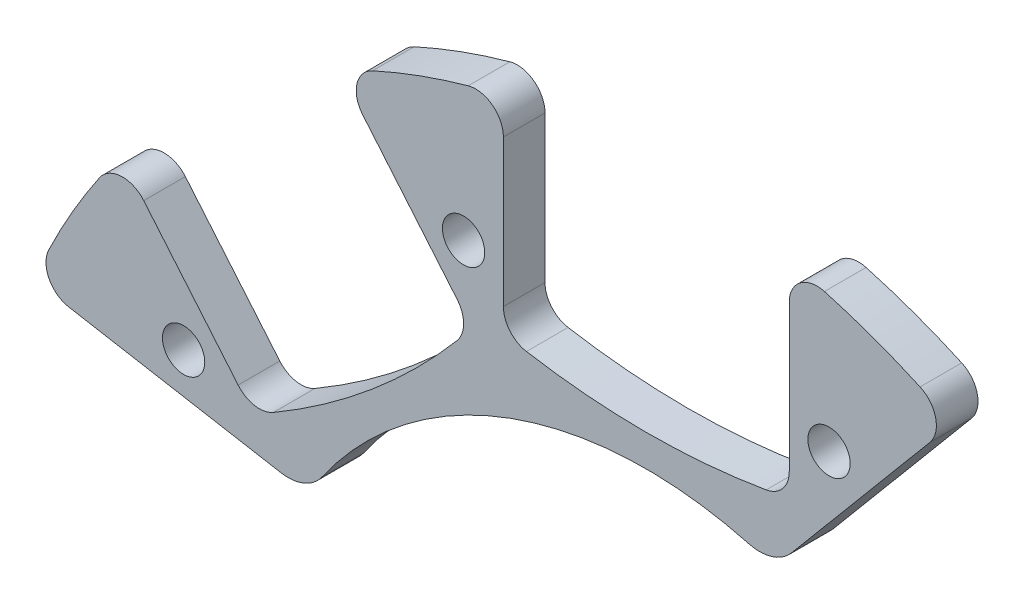
ISO-10303-21;
HEADER;
FILE_DESCRIPTION(('STEP AP214'),'2;1');
FILE_NAME('part.step','',(''),(''),'','','');
FILE_SCHEMA(('AUTOMOTIVE_DESIGN { 1 0 10303 214 1 1 1 1 }'));
ENDSEC;
DATA;
#1=APPLICATION_CONTEXT('core data for automotive mechanical design processes');
#2=APPLICATION_PROTOCOL_DEFINITION('international standard','automotive_design',2000,#1);
#3=PRODUCT_CONTEXT('',#1,'mechanical');
#4=PRODUCT('Part','Part','',(#3));
#5=PRODUCT_RELATED_PRODUCT_CATEGORY('part','',(#4));
#6=PRODUCT_DEFINITION_FORMATION('','',#4);
#7=PRODUCT_DEFINITION_CONTEXT('part definition',#1,'design');
#8=PRODUCT_DEFINITION('design','',#6,#7);
#9=PRODUCT_DEFINITION_SHAPE('','',#8);
#10=(LENGTH_UNIT() NAMED_UNIT(*) SI_UNIT(.MILLI.,.METRE.));
#11=(NAMED_UNIT(*) PLANE_ANGLE_UNIT() SI_UNIT($,.RADIAN.));
#12=(NAMED_UNIT(*) SI_UNIT($,.STERADIAN.) SOLID_ANGLE_UNIT());
#13=UNCERTAINTY_MEASURE_WITH_UNIT(LENGTH_MEASURE(1.E-05),#10,'distance_accuracy_value','');
#14=(GEOMETRIC_REPRESENTATION_CONTEXT(3) GLOBAL_UNCERTAINTY_ASSIGNED_CONTEXT((#13)) GLOBAL_UNIT_ASSIGNED_CONTEXT((#10,
#11,#12)) REPRESENTATION_CONTEXT('',''));
#15=CARTESIAN_POINT('',(0.,0.,0.));
#16=DIRECTION('',(0.,0.,1.));
#17=DIRECTION('',(1.,0.,0.));
#18=AXIS2_PLACEMENT_3D('',#15,#16,#17);
#19=CARTESIAN_POINT('',(0.,0.,3.));
#20=DIRECTION('',(0.,0.,-1.));
#21=DIRECTION('',(-1.,0.,0.));
#22=AXIS2_PLACEMENT_3D('',#19,#20,#21);
#23=CYLINDRICAL_SURFACE('',#22,47.75);
#24=CARTESIAN_POINT('',(0.,0.,0.));
#25=DIRECTION('',(0.,0.,1.));
#26=DIRECTION('',(1.,0.,0.));
#27=AXIS2_PLACEMENT_3D('',#24,#25,#26);
#28=CIRCLE('',#27,47.75);
#29=CARTESIAN_POINT('',(-39.3972827370427,26.9799298171347,0.));
#30=VERTEX_POINT('',#29);
#31=CARTESIAN_POINT('',(-43.0639459824808,20.6290827817907,0.));
#32=VERTEX_POINT('',#31);
#33=EDGE_CURVE('E332',#30,#32,#28,.T.);
#34=ORIENTED_EDGE('',*,*,#33,.T.);
#35=DIRECTION('',(0.,0.,-1.));
#36=VECTOR('',#35,1.);
#37=CARTESIAN_POINT('',(-43.0639459824808,20.6290827817908,3.));
#38=LINE('',#37,#36);
#39=CARTESIAN_POINT('',(-43.0639459824808,20.6290827817907,3.));
#40=VERTEX_POINT('',#39);
#41=EDGE_CURVE('E221',#32,#40,#38,.F.);
#42=ORIENTED_EDGE('',*,*,#41,.T.);
#43=CARTESIAN_POINT('',(0.,0.,3.));
#44=DIRECTION('',(0.,0.,1.));
#45=DIRECTION('',(1.,0.,0.));
#46=AXIS2_PLACEMENT_3D('',#43,#44,#45);
#47=CIRCLE('',#46,47.75);
#48=CARTESIAN_POINT('',(-39.3972827370427,26.9799298171347,3.));
#49=VERTEX_POINT('',#48);
#50=EDGE_CURVE('E211',#49,#40,#47,.T.);
#51=ORIENTED_EDGE('',*,*,#50,.F.);
#52=DIRECTION('',(0.,0.,-1.));
#53=VECTOR('',#52,1.);
#54=CARTESIAN_POINT('',(-39.3972827370427,26.9799298171347,3.));
#55=LINE('',#54,#53);
#56=EDGE_CURVE('E226',#49,#30,#55,.T.);
#57=ORIENTED_EDGE('',*,*,#56,.T.);
#58=EDGE_LOOP('',(#34,#42,#51,#57));
#59=FACE_BOUND('',#58,.T.);
#60=ADVANCED_FACE('F37',(#59),#23,.T.);
#61=CARTESIAN_POINT('',(-12.8377049180328,45.9919105108444,0.));
#62=VERTEX_POINT('',#61);
#63=CARTESIAN_POINT('',(-19.7287777073222,43.4837651333813,0.));
#64=VERTEX_POINT('',#63);
#65=EDGE_CURVE('E347',#62,#64,#28,.T.);
#66=ORIENTED_EDGE('',*,*,#65,.T.);
#67=DIRECTION('',(0.,0.,-1.));
#68=VECTOR('',#67,1.);
#69=CARTESIAN_POINT('',(-19.7287777073222,43.4837651333813,3.));
#70=LINE('',#69,#68);
#71=CARTESIAN_POINT('',(-19.7287777073222,43.4837651333813,3.));
#72=VERTEX_POINT('',#71);
#73=EDGE_CURVE('E231',#64,#72,#70,.F.);
#74=ORIENTED_EDGE('',*,*,#73,.T.);
#75=CARTESIAN_POINT('',(-12.8377049180328,45.9919105108444,3.));
#76=VERTEX_POINT('',#75);
#77=EDGE_CURVE('E342',#76,#72,#47,.T.);
#78=ORIENTED_EDGE('',*,*,#77,.F.);
#79=DIRECTION('',(0.,0.,-1.));
#80=VECTOR('',#79,1.);
#81=CARTESIAN_POINT('',(-12.8377049180328,45.9919105108444,3.));
#82=LINE('',#81,#80);
#83=EDGE_CURVE('E224',#76,#62,#82,.T.);
#84=ORIENTED_EDGE('',*,*,#83,.T.);
#85=EDGE_LOOP('',(#66,#74,#78,#84));
#86=FACE_BOUND('',#85,.T.);
#87=ADVANCED_FACE('F425',(#86),#23,.T.);
#88=CARTESIAN_POINT('',(19.7287777073227,43.483765133381,3.));
#89=VERTEX_POINT('',#88);
#90=CARTESIAN_POINT('',(12.8377049180328,45.9919105108444,3.));
#91=VERTEX_POINT('',#90);
#92=EDGE_CURVE('E344',#89,#91,#47,.T.);
#93=ORIENTED_EDGE('',*,*,#92,.F.);
#94=DIRECTION('',(0.,0.,-1.));
#95=VECTOR('',#94,1.);
#96=CARTESIAN_POINT('',(19.7287777073227,43.483765133381,3.));
#97=LINE('',#96,#95);
#98=CARTESIAN_POINT('',(19.7287777073227,43.483765133381,0.));
#99=VERTEX_POINT('',#98);
#100=EDGE_CURVE('E245',#89,#99,#97,.T.);
#101=ORIENTED_EDGE('',*,*,#100,.T.);
#102=CARTESIAN_POINT('',(12.8377049180328,45.9919105108444,0.));
#103=VERTEX_POINT('',#102);
#104=EDGE_CURVE('E343',#99,#103,#28,.T.);
#105=ORIENTED_EDGE('',*,*,#104,.T.);
#106=DIRECTION('',(0.,0.,-1.));
#107=VECTOR('',#106,1.);
#108=CARTESIAN_POINT('',(12.8377049180328,45.9919105108444,3.));
#109=LINE('',#108,#107);
#110=EDGE_CURVE('E242',#103,#91,#109,.F.);
#111=ORIENTED_EDGE('',*,*,#110,.T.);
#112=EDGE_LOOP('',(#93,#101,#105,#111));
#113=FACE_BOUND('',#112,.T.);
#114=ADVANCED_FACE('F427',(#113),#23,.T.);
#115=CARTESIAN_POINT('',(0.,0.,3.));
#116=DIRECTION('',(0.,0.,1.));
#117=DIRECTION('',(1.,0.,0.));
#118=AXIS2_PLACEMENT_3D('',#115,#116,#117);
#119=PLANE('',#118);
#120=DIRECTION('',(-0.984807753012206,0.17364817766694,0.));
#121=VECTOR('',#120,1.);
#122=CARTESIAN_POINT('',(-44.1289499231318,18.2400186042045,3.));
#123=LINE('',#122,#121);
#124=CARTESIAN_POINT('',(-26.332125888612,15.1019583559976,3.));
#125=VERTEX_POINT('',#124);
#126=CARTESIAN_POINT('',(-41.6075168516375,17.7954219236494,3.));
#127=VERTEX_POINT('',#126);
#128=EDGE_CURVE('E196',#125,#127,#123,.T.);
#129=ORIENTED_EDGE('',*,*,#128,.F.);
#130=CARTESIAN_POINT('',(-25.8111813556112,18.0563816150343,3.));
#131=DIRECTION('',(0.,0.,1.));
#132=DIRECTION('',(1.,0.,0.));
#133=AXIS2_PLACEMENT_3D('',#130,#131,#132);
#134=CIRCLE('',#133,3.);
#135=CARTESIAN_POINT('',(-23.3529736074578,16.3367262231262,3.));
#136=VERTEX_POINT('',#135);
#137=EDGE_CURVE('E45',#125,#136,#134,.T.);
#138=ORIENTED_EDGE('',*,*,#137,.T.);
#139=CARTESIAN_POINT('',(0.,0.,3.));
#140=DIRECTION('',(0.,0.,-1.));
#141=DIRECTION('',(-1.,0.,0.));
#142=AXIS2_PLACEMENT_3D('',#139,#140,#141);
#143=CIRCLE('',#142,28.5);
#144=CARTESIAN_POINT('',(7.38837046323079,27.5256604261925,3.));
#145=VERTEX_POINT('',#144);
#146=EDGE_CURVE('E299',#136,#145,#143,.T.);
#147=ORIENTED_EDGE('',*,*,#146,.T.);
#148=CARTESIAN_POINT('',(8.16609366988667,30.4230983657917,3.));
#149=DIRECTION('',(0.,0.,1.));
#150=DIRECTION('',(1.,0.,0.));
#151=AXIS2_PLACEMENT_3D('',#148,#149,#150);
#152=CIRCLE('',#151,3.);
#153=CARTESIAN_POINT('',(10.4642269992436,28.4947355367321,3.));
#154=VERTEX_POINT('',#153);
#155=EDGE_CURVE('E52',#145,#154,#152,.T.);
#156=ORIENTED_EDGE('',*,*,#155,.T.);
#157=DIRECTION('',(-0.642787609686541,-0.766044443118977,0.));
#158=VECTOR('',#157,1.);
#159=CARTESIAN_POINT('',(17.5994848979943,36.9982047716544,3.));
#160=LINE('',#159,#158);
#161=CARTESIAN_POINT('',(20.4345303545105,40.3768803796255,3.));
#162=VERTEX_POINT('',#161);
#163=EDGE_CURVE('E314',#162,#154,#160,.T.);
#164=ORIENTED_EDGE('',*,*,#163,.F.);
#165=CARTESIAN_POINT('',(18.9024414682726,41.6624555989986,3.));
#166=DIRECTION('',(0.,0.,1.));
#167=DIRECTION('',(1.,0.,0.));
#168=AXIS2_PLACEMENT_3D('',#165,#166,#167);
#169=CIRCLE('',#168,2.);
#170=EDGE_CURVE('E350',#162,#89,#169,.T.);
#171=ORIENTED_EDGE('',*,*,#170,.T.);
#172=ORIENTED_EDGE('',*,*,#92,.T.);
#173=CARTESIAN_POINT('',(12.3,44.0655477669346,3.));
#174=DIRECTION('',(0.,0.,1.));
#175=DIRECTION('',(1.,0.,0.));
#176=AXIS2_PLACEMENT_3D('',#173,#174,#175);
#177=CIRCLE('',#176,2.);
#178=CARTESIAN_POINT('',(10.3,44.0655477669346,3.));
#179=VERTEX_POINT('',#178);
#180=EDGE_CURVE('E348',#91,#179,#177,.T.);
#181=ORIENTED_EDGE('',*,*,#180,.T.);
#182=DIRECTION('',(0.,1.,0.));
#183=VECTOR('',#182,1.);
#184=CARTESIAN_POINT('',(10.3,46.6258780078188,3.));
#185=LINE('',#184,#183);
#186=CARTESIAN_POINT('',(10.3,33.4844286262897,3.));
#187=VERTEX_POINT('',#186);
#188=EDGE_CURVE('E326',#187,#179,#185,.T.);
#189=ORIENTED_EDGE('',*,*,#188,.F.);
#190=CARTESIAN_POINT('',(8.3,33.4844286262897,3.));
#191=DIRECTION('',(0.,0.,1.));
#192=DIRECTION('',(1.,0.,0.));
#193=AXIS2_PLACEMENT_3D('',#190,#191,#192);
#194=CIRCLE('',#193,2.);
#195=CARTESIAN_POINT('',(8.63705583756345,31.5130348649208,3.));
#196=VERTEX_POINT('',#195);
#197=EDGE_CURVE('E278',#187,#196,#194,.F.);
#198=ORIENTED_EDGE('',*,*,#197,.T.);
#199=CARTESIAN_POINT('',(0.,82.03,3.));
#200=DIRECTION('',(0.,0.,1.));
#201=DIRECTION('',(1.,0.,0.));
#202=AXIS2_PLACEMENT_3D('',#199,#200,#201);
#203=CIRCLE('',#202,51.25);
#204=CARTESIAN_POINT('',(-8.63705583756345,31.5130348649208,3.));
#205=VERTEX_POINT('',#204);
#206=EDGE_CURVE('E336',#205,#196,#203,.T.);
#207=ORIENTED_EDGE('',*,*,#206,.F.);
#208=CARTESIAN_POINT('',(-8.3,33.4844286262897,3.));
#209=DIRECTION('',(0.,0.,1.));
#210=DIRECTION('',(1.,0.,0.));
#211=AXIS2_PLACEMENT_3D('',#208,#209,#210);
#212=CIRCLE('',#211,2.);
#213=CARTESIAN_POINT('',(-10.3,33.4844286262897,3.));
#214=VERTEX_POINT('',#213);
#215=EDGE_CURVE('E283',#205,#214,#212,.F.);
#216=ORIENTED_EDGE('',*,*,#215,.T.);
#217=DIRECTION('',(0.,-1.,0.));
#218=VECTOR('',#217,1.);
#219=CARTESIAN_POINT('',(-10.3,39.655,3.));
#220=LINE('',#219,#218);
#221=CARTESIAN_POINT('',(-10.3,44.0655477669346,3.));
#222=VERTEX_POINT('',#221);
#223=EDGE_CURVE('E333',#222,#214,#220,.T.);
#224=ORIENTED_EDGE('',*,*,#223,.F.);
#225=CARTESIAN_POINT('',(-12.3,44.0655477669346,3.));
#226=DIRECTION('',(0.,0.,1.));
#227=DIRECTION('',(1.,0.,0.));
#228=AXIS2_PLACEMENT_3D('',#225,#226,#227);
#229=CIRCLE('',#228,2.);
#230=EDGE_CURVE('E352',#222,#76,#229,.T.);
#231=ORIENTED_EDGE('',*,*,#230,.T.);
#232=ORIENTED_EDGE('',*,*,#77,.T.);
#233=CARTESIAN_POINT('',(-18.902441468272,41.6624555989988,3.));
#234=DIRECTION('',(0.,0.,1.));
#235=DIRECTION('',(1.,0.,0.));
#236=AXIS2_PLACEMENT_3D('',#233,#234,#235);
#237=CIRCLE('',#236,2.);
#238=CARTESIAN_POINT('',(-20.43453035451,40.3768803796258,3.));
#239=VERTEX_POINT('',#238);
#240=EDGE_CURVE('E354',#72,#239,#237,.T.);
#241=ORIENTED_EDGE('',*,*,#240,.T.);
#242=DIRECTION('',(-0.64278760968653,0.766044443118986,0.));
#243=VECTOR('',#242,1.);
#244=CARTESIAN_POINT('',(-22.080278910056,42.3382071332046,3.));
#245=LINE('',#244,#243);
#246=CARTESIAN_POINT('',(-13.6331180742864,32.2712728599548,3.));
#247=VERTEX_POINT('',#246);
#248=EDGE_CURVE('E319',#247,#239,#245,.T.);
#249=ORIENTED_EDGE('',*,*,#248,.F.);
#250=CARTESIAN_POINT('',(-15.1652069605244,30.9856976405817,3.));
#251=DIRECTION('',(0.,0.,1.));
#252=DIRECTION('',(1.,0.,0.));
#253=AXIS2_PLACEMENT_3D('',#250,#251,#252);
#254=CIRCLE('',#253,2.);
#255=CARTESIAN_POINT('',(-13.6398197255168,29.6921777206439,3.));
#256=VERTEX_POINT('',#255);
#257=EDGE_CURVE('E269',#247,#256,#254,.F.);
#258=ORIENTED_EDGE('',*,*,#257,.T.);
#259=CARTESIAN_POINT('',(-52.7278676225861,62.8386256690504,3.));
#260=DIRECTION('',(0.,0.,1.));
#261=DIRECTION('',(1.,0.,0.));
#262=AXIS2_PLACEMENT_3D('',#259,#260,#261);
#263=CIRCLE('',#262,51.25);
#264=CARTESIAN_POINT('',(-26.8725569840646,18.5885927675309,3.));
#265=VERTEX_POINT('',#264);
#266=EDGE_CURVE('E391',#265,#256,#263,.T.);
#267=ORIENTED_EDGE('',*,*,#266,.F.);
#268=CARTESIAN_POINT('',(-27.8815447162996,20.3154233197853,3.));
#269=DIRECTION('',(0.,0.,1.));
#270=DIRECTION('',(1.,0.,0.));
#271=AXIS2_PLACEMENT_3D('',#268,#269,#270);
#272=CIRCLE('',#271,2.);
#273=CARTESIAN_POINT('',(-29.4136336025375,19.0298481004123,3.));
#274=VERTEX_POINT('',#273);
#275=EDGE_CURVE('E274',#265,#274,#272,.F.);
#276=ORIENTED_EDGE('',*,*,#275,.T.);
#277=DIRECTION('',(0.64278760968653,-0.766044443118986,0.));
#278=VECTOR('',#277,1.);
#279=CARTESIAN_POINT('',(-33.3800004262449,23.7567800121121,3.));
#280=LINE('',#279,#278);
#281=CARTESIAN_POINT('',(-36.2150458827611,27.1354556200833,3.));
#282=VERTEX_POINT('',#281);
#283=EDGE_CURVE('E382',#282,#274,#280,.T.);
#284=ORIENTED_EDGE('',*,*,#283,.F.);
#285=CARTESIAN_POINT('',(-37.7471347689991,25.8498804007102,3.));
#286=DIRECTION('',(0.,0.,1.));
#287=DIRECTION('',(1.,0.,0.));
#288=AXIS2_PLACEMENT_3D('',#285,#286,#287);
#289=CIRCLE('',#288,2.);
#290=EDGE_CURVE('E216',#282,#49,#289,.T.);
#291=ORIENTED_EDGE('',*,*,#290,.T.);
#292=ORIENTED_EDGE('',*,*,#50,.T.);
#293=CARTESIAN_POINT('',(-41.2602204963036,19.7650374296738,3.));
#294=DIRECTION('',(0.,0.,1.));
#295=DIRECTION('',(1.,0.,0.));
#296=AXIS2_PLACEMENT_3D('',#293,#294,#295);
#297=CIRCLE('',#296,2.);
#298=EDGE_CURVE('E207',#40,#127,#297,.T.);
#299=ORIENTED_EDGE('',*,*,#298,.T.);
#300=EDGE_LOOP('',(#129,#138,#147,#156,#164,#171,#172,#181,#189,#198,#207,#216,#224,#231,#232,
#241,#249,#258,#267,#276,#284,#291,#292,#299));
#301=FACE_BOUND('',#300,.T.);
#302=CARTESIAN_POINT('',(13.1677755180385,36.1781659002574,3.));
#303=DIRECTION('',(0.,0.,1.));
#304=DIRECTION('',(1.,0.,0.));
#305=AXIS2_PLACEMENT_3D('',#302,#303,#304);
#306=CIRCLE('',#305,1.525);
#307=CARTESIAN_POINT('',(14.6927755180385,36.1781659002574,3.));
#308=VERTEX_POINT('',#307);
#309=EDGE_CURVE('E307',#308,#308,#306,.T.);
#310=ORIENTED_EDGE('',*,*,#309,.F.);
#311=EDGE_LOOP('',(#310));
#312=FACE_BOUND('',#311,.T.);
#313=CARTESIAN_POINT('',(-13.167775518038,36.1781659002576,3.));
#314=DIRECTION('',(0.,0.,1.));
#315=DIRECTION('',(1.,0.,0.));
#316=AXIS2_PLACEMENT_3D('',#313,#314,#315);
#317=CIRCLE('',#316,1.525);
#318=CARTESIAN_POINT('',(-11.642775518038,36.1781659002576,3.));
#319=VERTEX_POINT('',#318);
#320=EDGE_CURVE('E582',#319,#319,#317,.T.);
#321=ORIENTED_EDGE('',*,*,#320,.F.);
#322=EDGE_LOOP('',(#321));
#323=FACE_BOUND('',#322,.T.);
#324=CARTESIAN_POINT('',(-33.3419780457008,19.2500000000002,3.));
#325=DIRECTION('',(0.,0.,1.));
#326=DIRECTION('',(1.,0.,0.));
#327=AXIS2_PLACEMENT_3D('',#324,#325,#326);
#328=CIRCLE('',#327,1.525);
#329=CARTESIAN_POINT('',(-31.8169780457008,19.2500000000002,3.));
#330=VERTEX_POINT('',#329);
#331=EDGE_CURVE('E576',#330,#330,#328,.T.);
#332=ORIENTED_EDGE('',*,*,#331,.F.);
#333=EDGE_LOOP('',(#332));
#334=FACE_BOUND('',#333,.T.);
#335=ADVANCED_FACE('F208',(#301,#312,#323,#334),#119,.T.);
#336=CARTESIAN_POINT('',(0.,0.,0.));
#337=DIRECTION('',(0.,0.,1.));
#338=DIRECTION('',(1.,0.,0.));
#339=AXIS2_PLACEMENT_3D('',#336,#337,#338);
#340=PLANE('',#339);
#341=CARTESIAN_POINT('',(0.,0.,0.));
#342=DIRECTION('',(0.,0.,-1.));
#343=DIRECTION('',(-1.,0.,0.));
#344=AXIS2_PLACEMENT_3D('',#341,#342,#343);
#345=CIRCLE('',#344,28.5);
#346=CARTESIAN_POINT('',(-23.3529736074578,16.3367262231262,0.));
#347=VERTEX_POINT('',#346);
#348=CARTESIAN_POINT('',(7.38837046323079,27.5256604261925,0.));
#349=VERTEX_POINT('',#348);
#350=EDGE_CURVE('E308',#347,#349,#345,.T.);
#351=ORIENTED_EDGE('',*,*,#350,.F.);
#352=CARTESIAN_POINT('',(-25.8111813556112,18.0563816150343,0.));
#353=DIRECTION('',(0.,0.,1.));
#354=DIRECTION('',(1.,0.,0.));
#355=AXIS2_PLACEMENT_3D('',#352,#353,#354);
#356=CIRCLE('',#355,3.);
#357=CARTESIAN_POINT('',(-26.332125888612,15.1019583559976,0.));
#358=VERTEX_POINT('',#357);
#359=EDGE_CURVE('E295',#347,#358,#356,.F.);
#360=ORIENTED_EDGE('',*,*,#359,.T.);
#361=DIRECTION('',(-0.984807753012206,0.17364817766694,0.));
#362=VECTOR('',#361,1.);
#363=CARTESIAN_POINT('',(-44.1289499231318,18.2400186042045,0.));
#364=LINE('',#363,#362);
#365=CARTESIAN_POINT('',(-41.6075168516375,17.7954219236494,0.));
#366=VERTEX_POINT('',#365);
#367=EDGE_CURVE('E203',#358,#366,#364,.T.);
#368=ORIENTED_EDGE('',*,*,#367,.T.);
#369=CARTESIAN_POINT('',(-41.2602204963036,19.7650374296738,0.));
#370=DIRECTION('',(0.,0.,1.));
#371=DIRECTION('',(1.,0.,0.));
#372=AXIS2_PLACEMENT_3D('',#369,#370,#371);
#373=CIRCLE('',#372,2.);
#374=EDGE_CURVE('E219',#366,#32,#373,.F.);
#375=ORIENTED_EDGE('',*,*,#374,.T.);
#376=ORIENTED_EDGE('',*,*,#33,.F.);
#377=CARTESIAN_POINT('',(-37.7471347689991,25.8498804007102,0.));
#378=DIRECTION('',(0.,0.,1.));
#379=DIRECTION('',(1.,0.,0.));
#380=AXIS2_PLACEMENT_3D('',#377,#378,#379);
#381=CIRCLE('',#380,2.);
#382=CARTESIAN_POINT('',(-36.2150458827611,27.1354556200833,0.));
#383=VERTEX_POINT('',#382);
#384=EDGE_CURVE('E366',#30,#383,#381,.F.);
#385=ORIENTED_EDGE('',*,*,#384,.T.);
#386=DIRECTION('',(0.64278760968653,-0.766044443118986,0.));
#387=VECTOR('',#386,1.);
#388=CARTESIAN_POINT('',(-33.3800004262449,23.7567800121121,0.));
#389=LINE('',#388,#387);
#390=CARTESIAN_POINT('',(-29.4136336025375,19.0298481004123,0.));
#391=VERTEX_POINT('',#390);
#392=EDGE_CURVE('E384',#383,#391,#389,.T.);
#393=ORIENTED_EDGE('',*,*,#392,.T.);
#394=CARTESIAN_POINT('',(-27.8815447162996,20.3154233197853,0.));
#395=DIRECTION('',(0.,0.,1.));
#396=DIRECTION('',(1.,0.,0.));
#397=AXIS2_PLACEMENT_3D('',#394,#395,#396);
#398=CIRCLE('',#397,2.);
#399=CARTESIAN_POINT('',(-26.8725569840646,18.5885927675309,0.));
#400=VERTEX_POINT('',#399);
#401=EDGE_CURVE('E276',#391,#400,#398,.T.);
#402=ORIENTED_EDGE('',*,*,#401,.T.);
#403=CARTESIAN_POINT('',(-52.7278676225861,62.8386256690504,0.));
#404=DIRECTION('',(0.,0.,1.));
#405=DIRECTION('',(1.,0.,0.));
#406=AXIS2_PLACEMENT_3D('',#403,#404,#405);
#407=CIRCLE('',#406,51.25);
#408=CARTESIAN_POINT('',(-13.6398197255168,29.6921777206439,0.));
#409=VERTEX_POINT('',#408);
#410=EDGE_CURVE('E386',#400,#409,#407,.T.);
#411=ORIENTED_EDGE('',*,*,#410,.T.);
#412=CARTESIAN_POINT('',(-15.1652069605244,30.9856976405817,0.));
#413=DIRECTION('',(0.,0.,1.));
#414=DIRECTION('',(1.,0.,0.));
#415=AXIS2_PLACEMENT_3D('',#412,#413,#414);
#416=CIRCLE('',#415,2.);
#417=CARTESIAN_POINT('',(-13.6331180742864,32.2712728599548,0.));
#418=VERTEX_POINT('',#417);
#419=EDGE_CURVE('E271',#409,#418,#416,.T.);
#420=ORIENTED_EDGE('',*,*,#419,.T.);
#421=DIRECTION('',(-0.64278760968653,0.766044443118986,0.));
#422=VECTOR('',#421,1.);
#423=CARTESIAN_POINT('',(-22.080278910056,42.3382071332046,0.));
#424=LINE('',#423,#422);
#425=CARTESIAN_POINT('',(-20.43453035451,40.3768803796258,0.));
#426=VERTEX_POINT('',#425);
#427=EDGE_CURVE('E204',#418,#426,#424,.T.);
#428=ORIENTED_EDGE('',*,*,#427,.T.);
#429=CARTESIAN_POINT('',(-18.902441468272,41.6624555989988,0.));
#430=DIRECTION('',(0.,0.,1.));
#431=DIRECTION('',(1.,0.,0.));
#432=AXIS2_PLACEMENT_3D('',#429,#430,#431);
#433=CIRCLE('',#432,2.);
#434=EDGE_CURVE('E364',#426,#64,#433,.F.);
#435=ORIENTED_EDGE('',*,*,#434,.T.);
#436=ORIENTED_EDGE('',*,*,#65,.F.);
#437=CARTESIAN_POINT('',(-12.3,44.0655477669346,0.));
#438=DIRECTION('',(0.,0.,1.));
#439=DIRECTION('',(1.,0.,0.));
#440=AXIS2_PLACEMENT_3D('',#437,#438,#439);
#441=CIRCLE('',#440,2.);
#442=CARTESIAN_POINT('',(-10.3,44.0655477669346,0.));
#443=VERTEX_POINT('',#442);
#444=EDGE_CURVE('E361',#62,#443,#441,.F.);
#445=ORIENTED_EDGE('',*,*,#444,.T.);
#446=DIRECTION('',(0.,-1.,0.));
#447=VECTOR('',#446,1.);
#448=CARTESIAN_POINT('',(-10.3,39.655,0.));
#449=LINE('',#448,#447);
#450=CARTESIAN_POINT('',(-10.3,33.4844286262897,0.));
#451=VERTEX_POINT('',#450);
#452=EDGE_CURVE('E322',#443,#451,#449,.T.);
#453=ORIENTED_EDGE('',*,*,#452,.T.);
#454=CARTESIAN_POINT('',(-8.3,33.4844286262897,0.));
#455=DIRECTION('',(0.,0.,1.));
#456=DIRECTION('',(1.,0.,0.));
#457=AXIS2_PLACEMENT_3D('',#454,#455,#456);
#458=CIRCLE('',#457,2.);
#459=CARTESIAN_POINT('',(-8.63705583756345,31.5130348649208,0.));
#460=VERTEX_POINT('',#459);
#461=EDGE_CURVE('E285',#451,#460,#458,.T.);
#462=ORIENTED_EDGE('',*,*,#461,.T.);
#463=CARTESIAN_POINT('',(0.,82.03,0.));
#464=DIRECTION('',(0.,0.,1.));
#465=DIRECTION('',(1.,0.,0.));
#466=AXIS2_PLACEMENT_3D('',#463,#464,#465);
#467=CIRCLE('',#466,51.25);
#468=CARTESIAN_POINT('',(8.63705583756345,31.5130348649208,0.));
#469=VERTEX_POINT('',#468);
#470=EDGE_CURVE('E325',#460,#469,#467,.T.);
#471=ORIENTED_EDGE('',*,*,#470,.T.);
#472=CARTESIAN_POINT('',(8.3,33.4844286262897,0.));
#473=DIRECTION('',(0.,0.,1.));
#474=DIRECTION('',(1.,0.,0.));
#475=AXIS2_PLACEMENT_3D('',#472,#473,#474);
#476=CIRCLE('',#475,2.);
#477=CARTESIAN_POINT('',(10.3,33.4844286262897,0.));
#478=VERTEX_POINT('',#477);
#479=EDGE_CURVE('E280',#469,#478,#476,.T.);
#480=ORIENTED_EDGE('',*,*,#479,.T.);
#481=DIRECTION('',(0.,1.,0.));
#482=VECTOR('',#481,1.);
#483=CARTESIAN_POINT('',(10.3,46.6258780078188,0.));
#484=LINE('',#483,#482);
#485=CARTESIAN_POINT('',(10.3,44.0655477669346,0.));
#486=VERTEX_POINT('',#485);
#487=EDGE_CURVE('E329',#478,#486,#484,.T.);
#488=ORIENTED_EDGE('',*,*,#487,.T.);
#489=CARTESIAN_POINT('',(12.3,44.0655477669346,0.));
#490=DIRECTION('',(0.,0.,1.));
#491=DIRECTION('',(1.,0.,0.));
#492=AXIS2_PLACEMENT_3D('',#489,#490,#491);
#493=CIRCLE('',#492,2.);
#494=EDGE_CURVE('E215',#486,#103,#493,.F.);
#495=ORIENTED_EDGE('',*,*,#494,.T.);
#496=ORIENTED_EDGE('',*,*,#104,.F.);
#497=CARTESIAN_POINT('',(18.9024414682726,41.6624555989986,0.));
#498=DIRECTION('',(0.,0.,1.));
#499=DIRECTION('',(1.,0.,0.));
#500=AXIS2_PLACEMENT_3D('',#497,#498,#499);
#501=CIRCLE('',#500,2.);
#502=CARTESIAN_POINT('',(20.4345303545105,40.3768803796255,0.));
#503=VERTEX_POINT('',#502);
#504=EDGE_CURVE('E358',#99,#503,#501,.F.);
#505=ORIENTED_EDGE('',*,*,#504,.T.);
#506=DIRECTION('',(-0.642787609686541,-0.766044443118977,0.));
#507=VECTOR('',#506,1.);
#508=CARTESIAN_POINT('',(17.5994848979943,36.9982047716544,0.));
#509=LINE('',#508,#507);
#510=CARTESIAN_POINT('',(10.4642269992436,28.4947355367321,0.));
#511=VERTEX_POINT('',#510);
#512=EDGE_CURVE('E316',#503,#511,#509,.T.);
#513=ORIENTED_EDGE('',*,*,#512,.T.);
#514=CARTESIAN_POINT('',(8.16609366988667,30.4230983657917,0.));
#515=DIRECTION('',(0.,0.,1.));
#516=DIRECTION('',(1.,0.,0.));
#517=AXIS2_PLACEMENT_3D('',#514,#515,#516);
#518=CIRCLE('',#517,3.);
#519=EDGE_CURVE('E293',#511,#349,#518,.F.);
#520=ORIENTED_EDGE('',*,*,#519,.T.);
#521=EDGE_LOOP('',(#351,#360,#368,#375,#376,#385,#393,#402,#411,#420,#428,#435,#436,#445,#453,
#462,#471,#480,#488,#495,#496,#505,#513,#520));
#522=FACE_BOUND('',#521,.T.);
#523=CARTESIAN_POINT('',(13.1677755180385,36.1781659002574,0.));
#524=DIRECTION('',(0.,0.,1.));
#525=DIRECTION('',(1.,0.,0.));
#526=AXIS2_PLACEMENT_3D('',#523,#524,#525);
#527=CIRCLE('',#526,1.525);
#528=CARTESIAN_POINT('',(14.6927755180385,36.1781659002574,0.));
#529=VERTEX_POINT('',#528);
#530=EDGE_CURVE('E585',#529,#529,#527,.T.);
#531=ORIENTED_EDGE('',*,*,#530,.T.);
#532=EDGE_LOOP('',(#531));
#533=FACE_BOUND('',#532,.T.);
#534=CARTESIAN_POINT('',(-13.167775518038,36.1781659002576,0.));
#535=DIRECTION('',(0.,0.,1.));
#536=DIRECTION('',(1.,0.,0.));
#537=AXIS2_PLACEMENT_3D('',#534,#535,#536);
#538=CIRCLE('',#537,1.525);
#539=CARTESIAN_POINT('',(-11.642775518038,36.1781659002576,0.));
#540=VERTEX_POINT('',#539);
#541=EDGE_CURVE('E579',#540,#540,#538,.T.);
#542=ORIENTED_EDGE('',*,*,#541,.T.);
#543=EDGE_LOOP('',(#542));
#544=FACE_BOUND('',#543,.T.);
#545=CARTESIAN_POINT('',(-33.3419780457008,19.2500000000002,0.));
#546=DIRECTION('',(0.,0.,1.));
#547=DIRECTION('',(1.,0.,0.));
#548=AXIS2_PLACEMENT_3D('',#545,#546,#547);
#549=CIRCLE('',#548,1.525);
#550=CARTESIAN_POINT('',(-31.8169780457008,19.2500000000002,0.));
#551=VERTEX_POINT('',#550);
#552=EDGE_CURVE('E396',#551,#551,#549,.T.);
#553=ORIENTED_EDGE('',*,*,#552,.T.);
#554=EDGE_LOOP('',(#553));
#555=FACE_BOUND('',#554,.T.);
#556=ADVANCED_FACE('F312',(#522,#533,#544,#555),#340,.F.);
#557=CARTESIAN_POINT('',(10.3,46.6258780078188,0.));
#558=DIRECTION('',(1.,0.,0.));
#559=DIRECTION('',(0.,0.,-1.));
#560=AXIS2_PLACEMENT_3D('',#557,#558,#559);
#561=PLANE('',#560);
#562=ORIENTED_EDGE('',*,*,#188,.T.);
#563=DIRECTION('',(0.,0.,-1.));
#564=VECTOR('',#563,1.);
#565=CARTESIAN_POINT('',(10.3,44.0655477669346,0.));
#566=LINE('',#565,#564);
#567=EDGE_CURVE('E247',#179,#486,#566,.T.);
#568=ORIENTED_EDGE('',*,*,#567,.T.);
#569=ORIENTED_EDGE('',*,*,#487,.F.);
#570=DIRECTION('',(0.,0.,-1.));
#571=VECTOR('',#570,1.);
#572=CARTESIAN_POINT('',(10.3,33.4844286262897,3.));
#573=LINE('',#572,#571);
#574=EDGE_CURVE('E259',#478,#187,#573,.F.);
#575=ORIENTED_EDGE('',*,*,#574,.T.);
#576=EDGE_LOOP('',(#562,#568,#569,#575));
#577=FACE_BOUND('',#576,.T.);
#578=ADVANCED_FACE('F457',(#577),#561,.F.);
#579=CARTESIAN_POINT('',(0.,82.03,0.));
#580=DIRECTION('',(0.,0.,1.));
#581=DIRECTION('',(1.,0.,0.));
#582=AXIS2_PLACEMENT_3D('',#579,#580,#581);
#583=CYLINDRICAL_SURFACE('',#582,51.25);
#584=ORIENTED_EDGE('',*,*,#206,.T.);
#585=DIRECTION('',(0.,0.,1.));
#586=VECTOR('',#585,1.);
#587=CARTESIAN_POINT('',(8.63705583756345,31.5130348649208,0.));
#588=LINE('',#587,#586);
#589=EDGE_CURVE('E265',#196,#469,#588,.F.);
#590=ORIENTED_EDGE('',*,*,#589,.T.);
#591=ORIENTED_EDGE('',*,*,#470,.F.);
#592=DIRECTION('',(0.,0.,1.));
#593=VECTOR('',#592,1.);
#594=CARTESIAN_POINT('',(-8.63705583756345,31.5130348649208,0.));
#595=LINE('',#594,#593);
#596=EDGE_CURVE('E262',#460,#205,#595,.T.);
#597=ORIENTED_EDGE('',*,*,#596,.T.);
#598=EDGE_LOOP('',(#584,#590,#591,#597));
#599=FACE_BOUND('',#598,.T.);
#600=ADVANCED_FACE('F463',(#599),#583,.F.);
#601=CARTESIAN_POINT('',(-10.3,39.655,0.));
#602=DIRECTION('',(-1.,0.,0.));
#603=DIRECTION('',(0.,0.,1.));
#604=AXIS2_PLACEMENT_3D('',#601,#602,#603);
#605=PLANE('',#604);
#606=ORIENTED_EDGE('',*,*,#223,.T.);
#607=DIRECTION('',(0.,0.,-1.));
#608=VECTOR('',#607,1.);
#609=CARTESIAN_POINT('',(-10.3,33.4844286262897,0.));
#610=LINE('',#609,#608);
#611=EDGE_CURVE('E267',#214,#451,#610,.T.);
#612=ORIENTED_EDGE('',*,*,#611,.T.);
#613=ORIENTED_EDGE('',*,*,#452,.F.);
#614=DIRECTION('',(0.,0.,-1.));
#615=VECTOR('',#614,1.);
#616=CARTESIAN_POINT('',(-10.3,44.0655477669346,0.));
#617=LINE('',#616,#615);
#618=EDGE_CURVE('E236',#443,#222,#617,.F.);
#619=ORIENTED_EDGE('',*,*,#618,.T.);
#620=EDGE_LOOP('',(#606,#612,#613,#619));
#621=FACE_BOUND('',#620,.T.);
#622=ADVANCED_FACE('F471',(#621),#605,.F.);
#623=CARTESIAN_POINT('',(17.5994848979943,36.9982047716544,0.));
#624=DIRECTION('',(-0.766044443118977,0.642787609686541,0.));
#625=DIRECTION('',(-0.642787609686541,-0.766044443118977,0.));
#626=AXIS2_PLACEMENT_3D('',#623,#624,#625);
#627=PLANE('',#626);
#628=ORIENTED_EDGE('',*,*,#163,.T.);
#629=DIRECTION('',(0.,0.,-1.));
#630=VECTOR('',#629,1.);
#631=CARTESIAN_POINT('',(10.4642269992436,28.4947355367321,0.));
#632=LINE('',#631,#630);
#633=EDGE_CURVE('E11',#154,#511,#632,.T.);
#634=ORIENTED_EDGE('',*,*,#633,.T.);
#635=ORIENTED_EDGE('',*,*,#512,.F.);
#636=DIRECTION('',(0.,0.,-1.));
#637=VECTOR('',#636,1.);
#638=CARTESIAN_POINT('',(20.4345303545105,40.3768803796255,0.));
#639=LINE('',#638,#637);
#640=EDGE_CURVE('E239',#503,#162,#639,.F.);
#641=ORIENTED_EDGE('',*,*,#640,.T.);
#642=EDGE_LOOP('',(#628,#634,#635,#641));
#643=FACE_BOUND('',#642,.T.);
#644=ADVANCED_FACE('F488',(#643),#627,.F.);
#645=CARTESIAN_POINT('',(-22.080278910056,42.3382071332046,0.));
#646=DIRECTION('',(0.766044443118985,0.64278760968653,0.));
#647=DIRECTION('',(-0.64278760968653,0.766044443118986,0.));
#648=AXIS2_PLACEMENT_3D('',#645,#646,#647);
#649=PLANE('',#648);
#650=ORIENTED_EDGE('',*,*,#248,.T.);
#651=DIRECTION('',(0.,0.,-1.));
#652=VECTOR('',#651,1.);
#653=CARTESIAN_POINT('',(-20.43453035451,40.3768803796258,0.));
#654=LINE('',#653,#652);
#655=EDGE_CURVE('E234',#239,#426,#654,.T.);
#656=ORIENTED_EDGE('',*,*,#655,.T.);
#657=ORIENTED_EDGE('',*,*,#427,.F.);
#658=DIRECTION('',(0.,0.,-1.));
#659=VECTOR('',#658,1.);
#660=CARTESIAN_POINT('',(-13.6331180742864,32.2712728599548,3.));
#661=LINE('',#660,#659);
#662=EDGE_CURVE('E249',#418,#247,#661,.F.);
#663=ORIENTED_EDGE('',*,*,#662,.T.);
#664=EDGE_LOOP('',(#650,#656,#657,#663));
#665=FACE_BOUND('',#664,.T.);
#666=ADVANCED_FACE('F486',(#665),#649,.F.);
#667=CARTESIAN_POINT('',(-52.7278676225861,62.8386256690504,0.));
#668=DIRECTION('',(0.,0.,1.));
#669=DIRECTION('',(1.,0.,0.));
#670=AXIS2_PLACEMENT_3D('',#667,#668,#669);
#671=CYLINDRICAL_SURFACE('',#670,51.25);
#672=ORIENTED_EDGE('',*,*,#266,.T.);
#673=DIRECTION('',(0.,0.,1.));
#674=VECTOR('',#673,1.);
#675=CARTESIAN_POINT('',(-13.6398197255168,29.6921777206439,0.));
#676=LINE('',#675,#674);
#677=EDGE_CURVE('E255',#256,#409,#676,.F.);
#678=ORIENTED_EDGE('',*,*,#677,.T.);
#679=ORIENTED_EDGE('',*,*,#410,.F.);
#680=DIRECTION('',(0.,0.,1.));
#681=VECTOR('',#680,1.);
#682=CARTESIAN_POINT('',(-26.8725569840646,18.5885927675309,0.));
#683=LINE('',#682,#681);
#684=EDGE_CURVE('E252',#400,#265,#683,.T.);
#685=ORIENTED_EDGE('',*,*,#684,.T.);
#686=EDGE_LOOP('',(#672,#678,#679,#685));
#687=FACE_BOUND('',#686,.T.);
#688=ADVANCED_FACE('F401',(#687),#671,.F.);
#689=CARTESIAN_POINT('',(-33.3800004262449,23.7567800121121,0.));
#690=DIRECTION('',(-0.766044443118986,-0.64278760968653,0.));
#691=DIRECTION('',(0.64278760968653,-0.766044443118986,0.));
#692=AXIS2_PLACEMENT_3D('',#689,#690,#691);
#693=PLANE('',#692);
#694=ORIENTED_EDGE('',*,*,#283,.T.);
#695=DIRECTION('',(0.,0.,-1.));
#696=VECTOR('',#695,1.);
#697=CARTESIAN_POINT('',(-29.4136336025375,19.0298481004123,0.));
#698=LINE('',#697,#696);
#699=EDGE_CURVE('E257',#274,#391,#698,.T.);
#700=ORIENTED_EDGE('',*,*,#699,.T.);
#701=ORIENTED_EDGE('',*,*,#392,.F.);
#702=DIRECTION('',(0.,0.,-1.));
#703=VECTOR('',#702,1.);
#704=CARTESIAN_POINT('',(-36.2150458827611,27.1354556200833,0.));
#705=LINE('',#704,#703);
#706=EDGE_CURVE('E220',#383,#282,#705,.F.);
#707=ORIENTED_EDGE('',*,*,#706,.T.);
#708=EDGE_LOOP('',(#694,#700,#701,#707));
#709=FACE_BOUND('',#708,.T.);
#710=ADVANCED_FACE('F381',(#709),#693,.F.);
#711=CARTESIAN_POINT('',(-44.1289499231318,18.2400186042045,0.));
#712=DIRECTION('',(0.17364817766694,0.984807753012206,0.));
#713=DIRECTION('',(-0.984807753012207,0.17364817766694,0.));
#714=AXIS2_PLACEMENT_3D('',#711,#712,#713);
#715=PLANE('',#714);
#716=ORIENTED_EDGE('',*,*,#367,.F.);
#717=DIRECTION('',(0.,0.,-1.));
#718=VECTOR('',#717,1.);
#719=CARTESIAN_POINT('',(-26.332125888612,15.1019583559976,0.));
#720=LINE('',#719,#718);
#721=EDGE_CURVE('E60',#358,#125,#720,.F.);
#722=ORIENTED_EDGE('',*,*,#721,.T.);
#723=ORIENTED_EDGE('',*,*,#128,.T.);
#724=DIRECTION('',(0.,0.,-1.));
#725=VECTOR('',#724,1.);
#726=CARTESIAN_POINT('',(-41.6075168516375,17.7954219236494,0.));
#727=LINE('',#726,#725);
#728=EDGE_CURVE('E200',#127,#366,#727,.T.);
#729=ORIENTED_EDGE('',*,*,#728,.T.);
#730=EDGE_LOOP('',(#716,#722,#723,#729));
#731=FACE_BOUND('',#730,.T.);
#732=ADVANCED_FACE('F198',(#731),#715,.F.);
#733=CARTESIAN_POINT('',(-41.2602204963036,19.7650374296738,3.));
#734=DIRECTION('',(0.,0.,-1.));
#735=DIRECTION('',(-1.,0.,0.));
#736=AXIS2_PLACEMENT_3D('',#733,#734,#735);
#737=CYLINDRICAL_SURFACE('',#736,2.);
#738=ORIENTED_EDGE('',*,*,#374,.F.);
#739=ORIENTED_EDGE('',*,*,#728,.F.);
#740=ORIENTED_EDGE('',*,*,#298,.F.);
#741=ORIENTED_EDGE('',*,*,#41,.F.);
#742=EDGE_LOOP('',(#738,#739,#740,#741));
#743=FACE_BOUND('',#742,.T.);
#744=ADVANCED_FACE('F218',(#743),#737,.T.);
#745=CARTESIAN_POINT('',(-37.7471347689991,25.8498804007102,3.));
#746=DIRECTION('',(0.,0.,-1.));
#747=DIRECTION('',(-1.,0.,0.));
#748=AXIS2_PLACEMENT_3D('',#745,#746,#747);
#749=CYLINDRICAL_SURFACE('',#748,2.);
#750=ORIENTED_EDGE('',*,*,#384,.F.);
#751=ORIENTED_EDGE('',*,*,#56,.F.);
#752=ORIENTED_EDGE('',*,*,#290,.F.);
#753=ORIENTED_EDGE('',*,*,#706,.F.);
#754=EDGE_LOOP('',(#750,#751,#752,#753));
#755=FACE_BOUND('',#754,.T.);
#756=ADVANCED_FACE('F378',(#755),#749,.T.);
#757=CARTESIAN_POINT('',(-18.902441468272,41.6624555989988,3.));
#758=DIRECTION('',(0.,0.,-1.));
#759=DIRECTION('',(-1.,0.,0.));
#760=AXIS2_PLACEMENT_3D('',#757,#758,#759);
#761=CYLINDRICAL_SURFACE('',#760,2.);
#762=ORIENTED_EDGE('',*,*,#434,.F.);
#763=ORIENTED_EDGE('',*,*,#655,.F.);
#764=ORIENTED_EDGE('',*,*,#240,.F.);
#765=ORIENTED_EDGE('',*,*,#73,.F.);
#766=EDGE_LOOP('',(#762,#763,#764,#765));
#767=FACE_BOUND('',#766,.T.);
#768=ADVANCED_FACE('F483',(#767),#761,.T.);
#769=CARTESIAN_POINT('',(-12.3,44.0655477669346,3.));
#770=DIRECTION('',(0.,0.,-1.));
#771=DIRECTION('',(-1.,0.,0.));
#772=AXIS2_PLACEMENT_3D('',#769,#770,#771);
#773=CYLINDRICAL_SURFACE('',#772,2.);
#774=ORIENTED_EDGE('',*,*,#444,.F.);
#775=ORIENTED_EDGE('',*,*,#83,.F.);
#776=ORIENTED_EDGE('',*,*,#230,.F.);
#777=ORIENTED_EDGE('',*,*,#618,.F.);
#778=EDGE_LOOP('',(#774,#775,#776,#777));
#779=FACE_BOUND('',#778,.T.);
#780=ADVANCED_FACE('F475',(#779),#773,.T.);
#781=CARTESIAN_POINT('',(18.9024414682726,41.6624555989986,3.));
#782=DIRECTION('',(0.,0.,-1.));
#783=DIRECTION('',(-1.,0.,0.));
#784=AXIS2_PLACEMENT_3D('',#781,#782,#783);
#785=CYLINDRICAL_SURFACE('',#784,2.);
#786=ORIENTED_EDGE('',*,*,#504,.F.);
#787=ORIENTED_EDGE('',*,*,#100,.F.);
#788=ORIENTED_EDGE('',*,*,#170,.F.);
#789=ORIENTED_EDGE('',*,*,#640,.F.);
#790=EDGE_LOOP('',(#786,#787,#788,#789));
#791=FACE_BOUND('',#790,.T.);
#792=ADVANCED_FACE('F448',(#791),#785,.T.);
#793=CARTESIAN_POINT('',(12.3,44.0655477669346,3.));
#794=DIRECTION('',(0.,0.,-1.));
#795=DIRECTION('',(-1.,0.,0.));
#796=AXIS2_PLACEMENT_3D('',#793,#794,#795);
#797=CYLINDRICAL_SURFACE('',#796,2.);
#798=ORIENTED_EDGE('',*,*,#494,.F.);
#799=ORIENTED_EDGE('',*,*,#567,.F.);
#800=ORIENTED_EDGE('',*,*,#180,.F.);
#801=ORIENTED_EDGE('',*,*,#110,.F.);
#802=EDGE_LOOP('',(#798,#799,#800,#801));
#803=FACE_BOUND('',#802,.T.);
#804=ADVANCED_FACE('F422',(#803),#797,.T.);
#805=CARTESIAN_POINT('',(-15.1652069605244,30.9856976405817,0.));
#806=DIRECTION('',(0.,0.,1.));
#807=DIRECTION('',(1.,0.,0.));
#808=AXIS2_PLACEMENT_3D('',#805,#806,#807);
#809=CYLINDRICAL_SURFACE('',#808,2.);
#810=ORIENTED_EDGE('',*,*,#419,.F.);
#811=ORIENTED_EDGE('',*,*,#677,.F.);
#812=ORIENTED_EDGE('',*,*,#257,.F.);
#813=ORIENTED_EDGE('',*,*,#662,.F.);
#814=EDGE_LOOP('',(#810,#811,#812,#813));
#815=FACE_BOUND('',#814,.T.);
#816=ADVANCED_FACE('F407',(#815),#809,.F.);
#817=CARTESIAN_POINT('',(-27.8815447162996,20.3154233197853,0.));
#818=DIRECTION('',(0.,0.,1.));
#819=DIRECTION('',(1.,0.,0.));
#820=AXIS2_PLACEMENT_3D('',#817,#818,#819);
#821=CYLINDRICAL_SURFACE('',#820,2.);
#822=ORIENTED_EDGE('',*,*,#401,.F.);
#823=ORIENTED_EDGE('',*,*,#699,.F.);
#824=ORIENTED_EDGE('',*,*,#275,.F.);
#825=ORIENTED_EDGE('',*,*,#684,.F.);
#826=EDGE_LOOP('',(#822,#823,#824,#825));
#827=FACE_BOUND('',#826,.T.);
#828=ADVANCED_FACE('F411',(#827),#821,.F.);
#829=CARTESIAN_POINT('',(8.3,33.4844286262897,0.));
#830=DIRECTION('',(0.,0.,1.));
#831=DIRECTION('',(1.,0.,0.));
#832=AXIS2_PLACEMENT_3D('',#829,#830,#831);
#833=CYLINDRICAL_SURFACE('',#832,2.);
#834=ORIENTED_EDGE('',*,*,#479,.F.);
#835=ORIENTED_EDGE('',*,*,#589,.F.);
#836=ORIENTED_EDGE('',*,*,#197,.F.);
#837=ORIENTED_EDGE('',*,*,#574,.F.);
#838=EDGE_LOOP('',(#834,#835,#836,#837));
#839=FACE_BOUND('',#838,.T.);
#840=ADVANCED_FACE('F413',(#839),#833,.F.);
#841=CARTESIAN_POINT('',(-8.3,33.4844286262897,0.));
#842=DIRECTION('',(0.,0.,1.));
#843=DIRECTION('',(1.,0.,0.));
#844=AXIS2_PLACEMENT_3D('',#841,#842,#843);
#845=CYLINDRICAL_SURFACE('',#844,2.);
#846=ORIENTED_EDGE('',*,*,#461,.F.);
#847=ORIENTED_EDGE('',*,*,#611,.F.);
#848=ORIENTED_EDGE('',*,*,#215,.F.);
#849=ORIENTED_EDGE('',*,*,#596,.F.);
#850=EDGE_LOOP('',(#846,#847,#848,#849));
#851=FACE_BOUND('',#850,.T.);
#852=ADVANCED_FACE('F419',(#851),#845,.F.);
#853=CARTESIAN_POINT('',(-33.3419780457008,19.2500000000002,0.));
#854=DIRECTION('',(0.,0.,1.));
#855=DIRECTION('',(1.,0.,0.));
#856=AXIS2_PLACEMENT_3D('',#853,#854,#855);
#857=CYLINDRICAL_SURFACE('',#856,1.525);
#858=ORIENTED_EDGE('',*,*,#552,.F.);
#859=EDGE_LOOP('',(#858));
#860=FACE_BOUND('',#859,.T.);
#861=ORIENTED_EDGE('',*,*,#331,.T.);
#862=EDGE_LOOP('',(#861));
#863=FACE_BOUND('',#862,.T.);
#864=ADVANCED_FACE('F596',(#860,#863),#857,.F.);
#865=CARTESIAN_POINT('',(-13.167775518038,36.1781659002576,0.));
#866=DIRECTION('',(0.,0.,1.));
#867=DIRECTION('',(1.,0.,0.));
#868=AXIS2_PLACEMENT_3D('',#865,#866,#867);
#869=CYLINDRICAL_SURFACE('',#868,1.525);
#870=ORIENTED_EDGE('',*,*,#541,.F.);
#871=EDGE_LOOP('',(#870));
#872=FACE_BOUND('',#871,.T.);
#873=ORIENTED_EDGE('',*,*,#320,.T.);
#874=EDGE_LOOP('',(#873));
#875=FACE_BOUND('',#874,.T.);
#876=ADVANCED_FACE('F598',(#872,#875),#869,.F.);
#877=CARTESIAN_POINT('',(13.1677755180385,36.1781659002574,0.));
#878=DIRECTION('',(0.,0.,1.));
#879=DIRECTION('',(1.,0.,0.));
#880=AXIS2_PLACEMENT_3D('',#877,#878,#879);
#881=CYLINDRICAL_SURFACE('',#880,1.525);
#882=ORIENTED_EDGE('',*,*,#530,.F.);
#883=EDGE_LOOP('',(#882));
#884=FACE_BOUND('',#883,.T.);
#885=ORIENTED_EDGE('',*,*,#309,.T.);
#886=EDGE_LOOP('',(#885));
#887=FACE_BOUND('',#886,.T.);
#888=ADVANCED_FACE('F550',(#884,#887),#881,.F.);
#889=CARTESIAN_POINT('',(0.,0.,3.));
#890=DIRECTION('',(0.,0.,-1.));
#891=DIRECTION('',(-1.,0.,0.));
#892=AXIS2_PLACEMENT_3D('',#889,#890,#891);
#893=CYLINDRICAL_SURFACE('',#892,28.5);
#894=ORIENTED_EDGE('',*,*,#146,.F.);
#895=DIRECTION('',(0.,0.,-1.));
#896=VECTOR('',#895,1.);
#897=CARTESIAN_POINT('',(-23.3529736074578,16.3367262231262,3.));
#898=LINE('',#897,#896);
#899=EDGE_CURVE('E290',#136,#347,#898,.T.);
#900=ORIENTED_EDGE('',*,*,#899,.T.);
#901=ORIENTED_EDGE('',*,*,#350,.T.);
#902=DIRECTION('',(0.,0.,-1.));
#903=VECTOR('',#902,1.);
#904=CARTESIAN_POINT('',(7.38837046323079,27.5256604261925,3.));
#905=LINE('',#904,#903);
#906=EDGE_CURVE('E287',#349,#145,#905,.F.);
#907=ORIENTED_EDGE('',*,*,#906,.T.);
#908=EDGE_LOOP('',(#894,#900,#901,#907));
#909=FACE_BOUND('',#908,.T.);
#910=ADVANCED_FACE('F303',(#909),#893,.F.);
#911=CARTESIAN_POINT('',(-25.8111813556112,18.0563816150343,3.));
#912=DIRECTION('',(0.,0.,-1.));
#913=DIRECTION('',(-1.,0.,0.));
#914=AXIS2_PLACEMENT_3D('',#911,#912,#913);
#915=CYLINDRICAL_SURFACE('',#914,3.);
#916=ORIENTED_EDGE('',*,*,#137,.F.);
#917=ORIENTED_EDGE('',*,*,#721,.F.);
#918=ORIENTED_EDGE('',*,*,#359,.F.);
#919=ORIENTED_EDGE('',*,*,#899,.F.);
#920=EDGE_LOOP('',(#916,#917,#918,#919));
#921=FACE_BOUND('',#920,.T.);
#922=ADVANCED_FACE('F310',(#921),#915,.T.);
#923=CARTESIAN_POINT('',(8.16609366988667,30.4230983657917,3.));
#924=DIRECTION('',(0.,0.,-1.));
#925=DIRECTION('',(-1.,0.,0.));
#926=AXIS2_PLACEMENT_3D('',#923,#924,#925);
#927=CYLINDRICAL_SURFACE('',#926,3.);
#928=ORIENTED_EDGE('',*,*,#519,.F.);
#929=ORIENTED_EDGE('',*,*,#633,.F.);
#930=ORIENTED_EDGE('',*,*,#155,.F.);
#931=ORIENTED_EDGE('',*,*,#906,.F.);
#932=EDGE_LOOP('',(#928,#929,#930,#931));
#933=FACE_BOUND('',#932,.T.);
#934=ADVANCED_FACE('F39',(#933),#927,.T.);
#935=CLOSED_SHELL('',(#60,#87,#114,#335,#556,#578,#600,#622,#644,#666,#688,#710,#732,#744,#756,
#768,#780,#792,#804,#816,#828,#840,#852,#864,#876,#888,#910,#922,#934));
#936=MANIFOLD_SOLID_BREP('B2',#935);
#937=ADVANCED_BREP_SHAPE_REPRESENTATION('',(#18,#936),#14);
#938=SHAPE_DEFINITION_REPRESENTATION(#9,#937);
ENDSEC;
END-ISO-10303-21;
